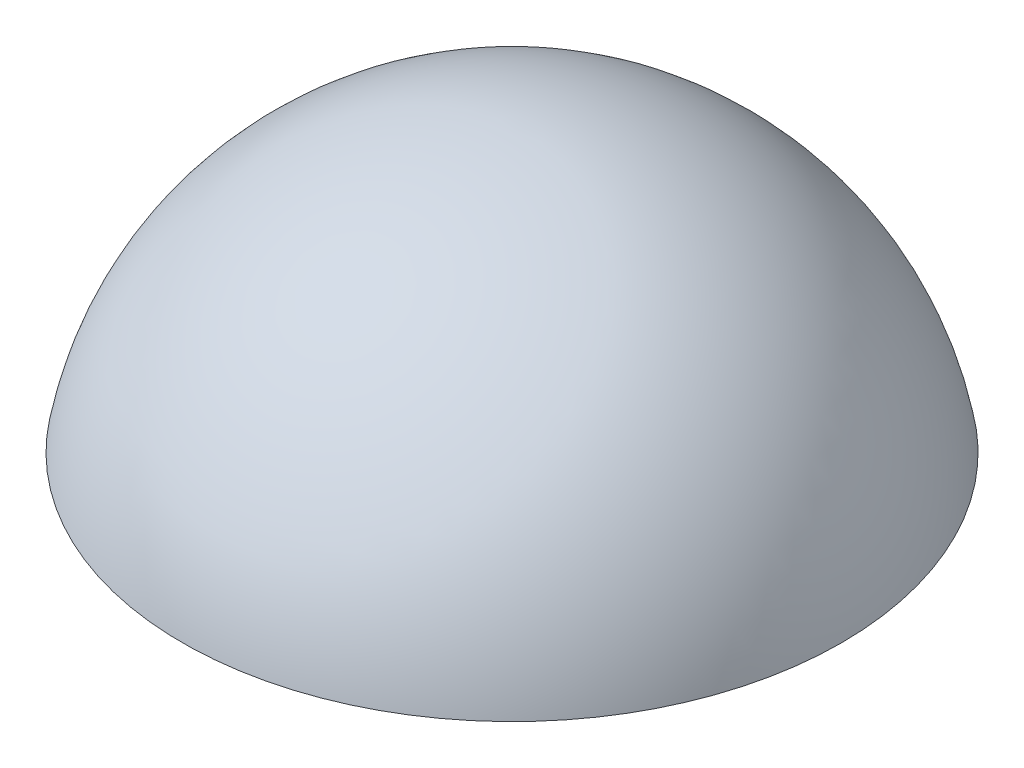
ISO-10303-21;
HEADER;
FILE_DESCRIPTION(('STEP AP214'),'2;1');
FILE_NAME('part.step','',(''),(''),'','','');
FILE_SCHEMA(('AUTOMOTIVE_DESIGN { 1 0 10303 214 1 1 1 1 }'));
ENDSEC;
DATA;
#1=APPLICATION_CONTEXT('core data for automotive mechanical design processes');
#2=APPLICATION_PROTOCOL_DEFINITION('international standard','automotive_design',2000,#1);
#3=PRODUCT_CONTEXT('',#1,'mechanical');
#4=PRODUCT('Part','Part','',(#3));
#5=PRODUCT_RELATED_PRODUCT_CATEGORY('part','',(#4));
#6=PRODUCT_DEFINITION_FORMATION('','',#4);
#7=PRODUCT_DEFINITION_CONTEXT('part definition',#1,'design');
#8=PRODUCT_DEFINITION('design','',#6,#7);
#9=PRODUCT_DEFINITION_SHAPE('','',#8);
#10=(LENGTH_UNIT() NAMED_UNIT(*) SI_UNIT(.MILLI.,.METRE.));
#11=(NAMED_UNIT(*) PLANE_ANGLE_UNIT() SI_UNIT($,.RADIAN.));
#12=(NAMED_UNIT(*) SI_UNIT($,.STERADIAN.) SOLID_ANGLE_UNIT());
#13=UNCERTAINTY_MEASURE_WITH_UNIT(LENGTH_MEASURE(1.E-05),#10,'distance_accuracy_value','');
#14=(GEOMETRIC_REPRESENTATION_CONTEXT(3) GLOBAL_UNCERTAINTY_ASSIGNED_CONTEXT((#13)) GLOBAL_UNIT_ASSIGNED_CONTEXT((#10,
#11,#12)) REPRESENTATION_CONTEXT('',''));
#15=CARTESIAN_POINT('',(0.,0.,0.));
#16=DIRECTION('',(0.,0.,1.));
#17=DIRECTION('',(1.,0.,0.));
#18=AXIS2_PLACEMENT_3D('',#15,#16,#17);
#19=CARTESIAN_POINT('',(0.,0.,0.));
#20=DIRECTION('',(0.,1.,0.));
#21=DIRECTION('',(1.,0.,0.));
#22=AXIS2_PLACEMENT_3D('',#19,#20,#21);
#23=SPHERICAL_SURFACE('',#22,33.);
#24=CARTESIAN_POINT('',(0.,5.72,0.));
#25=DIRECTION('',(0.,1.,0.));
#26=DIRECTION('',(-1.,0.,0.));
#27=AXIS2_PLACEMENT_3D('',#24,#25,#26);
#28=CIRCLE('',#27,32.5004861502101);
#29=CARTESIAN_POINT('',(-31.4483703870328,5.72,8.20253619315393));
#30=VERTEX_POINT('',#29);
#31=CARTESIAN_POINT('',(-31.4483703870328,5.72,-8.20253619315393));
#32=VERTEX_POINT('',#31);
#33=EDGE_CURVE('E11',#30,#32,#28,.T.);
#34=ORIENTED_EDGE('',*,*,#33,.T.);
#35=CARTESIAN_POINT('',(-31.4483703870328,0.,0.));
#36=DIRECTION('',(1.,0.,0.));
#37=DIRECTION('',(0.,0.,-1.));
#38=AXIS2_PLACEMENT_3D('',#35,#36,#37);
#39=CIRCLE('',#38,10.);
#40=EDGE_CURVE('E52',#30,#32,#39,.F.);
#41=ORIENTED_EDGE('',*,*,#40,.F.);
#42=EDGE_LOOP('',(#34,#41));
#43=FACE_BOUND('',#42,.T.);
#44=ADVANCED_FACE('F33',(#43),#23,.T.);
#45=CARTESIAN_POINT('',(0.,5.72,0.));
#46=DIRECTION('',(0.,1.,0.));
#47=DIRECTION('',(-1.,0.,0.));
#48=AXIS2_PLACEMENT_3D('',#45,#46,#47);
#49=PLANE('',#48);
#50=ORIENTED_EDGE('',*,*,#33,.F.);
#51=DIRECTION('',(1.,0.,0.));
#52=VECTOR('',#51,1.);
#53=CARTESIAN_POINT('',(-32.5014861502101,5.71999999999999,8.20253619315393));
#54=LINE('',#53,#52);
#55=CARTESIAN_POINT('',(-28.2842712474619,5.71999999999999,8.20253619315391));
#56=VERTEX_POINT('',#55);
#57=EDGE_CURVE('E59',#56,#30,#54,.F.);
#58=ORIENTED_EDGE('',*,*,#57,.F.);
#59=CARTESIAN_POINT('',(0.,5.72,0.));
#60=DIRECTION('',(0.,1.,0.));
#61=DIRECTION('',(-1.,0.,0.));
#62=AXIS2_PLACEMENT_3D('',#59,#60,#61);
#63=CIRCLE('',#62,29.4496451591526);
#64=CARTESIAN_POINT('',(-28.2842712474619,5.71999999999999,-8.20253619315391));
#65=VERTEX_POINT('',#64);
#66=EDGE_CURVE('E40',#56,#65,#63,.T.);
#67=ORIENTED_EDGE('',*,*,#66,.T.);
#68=DIRECTION('',(1.,0.,0.));
#69=VECTOR('',#68,1.);
#70=CARTESIAN_POINT('',(-32.5014861502101,5.71999999999999,-8.20253619315393));
#71=LINE('',#70,#69);
#72=EDGE_CURVE('E47',#32,#65,#71,.T.);
#73=ORIENTED_EDGE('',*,*,#72,.F.);
#74=EDGE_LOOP('',(#50,#58,#67,#73));
#75=FACE_BOUND('',#74,.T.);
#76=ADVANCED_FACE('F66',(#75),#49,.F.);
#77=CARTESIAN_POINT('',(0.,0.,0.));
#78=DIRECTION('',(0.,1.,0.));
#79=DIRECTION('',(1.,0.,0.));
#80=AXIS2_PLACEMENT_3D('',#77,#78,#79);
#81=SPHERICAL_SURFACE('',#80,30.);
#82=CARTESIAN_POINT('',(-28.2842712474619,0.,0.));
#83=DIRECTION('',(1.,0.,0.));
#84=DIRECTION('',(0.,0.,-1.));
#85=AXIS2_PLACEMENT_3D('',#82,#83,#84);
#86=CIRCLE('',#85,10.);
#87=EDGE_CURVE('E56',#56,#65,#86,.F.);
#88=ORIENTED_EDGE('',*,*,#87,.T.);
#89=ORIENTED_EDGE('',*,*,#66,.F.);
#90=EDGE_LOOP('',(#88,#89));
#91=FACE_BOUND('',#90,.T.);
#92=ADVANCED_FACE('F68',(#91),#81,.F.);
#93=CARTESIAN_POINT('',(-32.5014861502101,0.,0.));
#94=DIRECTION('',(1.,0.,0.));
#95=DIRECTION('',(0.,0.,-1.));
#96=AXIS2_PLACEMENT_3D('',#93,#94,#95);
#97=CYLINDRICAL_SURFACE('',#96,10.);
#98=ORIENTED_EDGE('',*,*,#40,.T.);
#99=ORIENTED_EDGE('',*,*,#72,.T.);
#100=ORIENTED_EDGE('',*,*,#87,.F.);
#101=ORIENTED_EDGE('',*,*,#57,.T.);
#102=EDGE_LOOP('',(#98,#99,#100,#101));
#103=FACE_BOUND('',#102,.T.);
#104=ADVANCED_FACE('F58',(#103),#97,.F.);
#105=CLOSED_SHELL('',(#44,#76,#92,#104));
#106=MANIFOLD_SOLID_BREP('B2',#105);
#107=ADVANCED_BREP_SHAPE_REPRESENTATION('',(#18,#106),#14);
#108=SHAPE_DEFINITION_REPRESENTATION(#9,#107);
ENDSEC;
END-ISO-10303-21;
